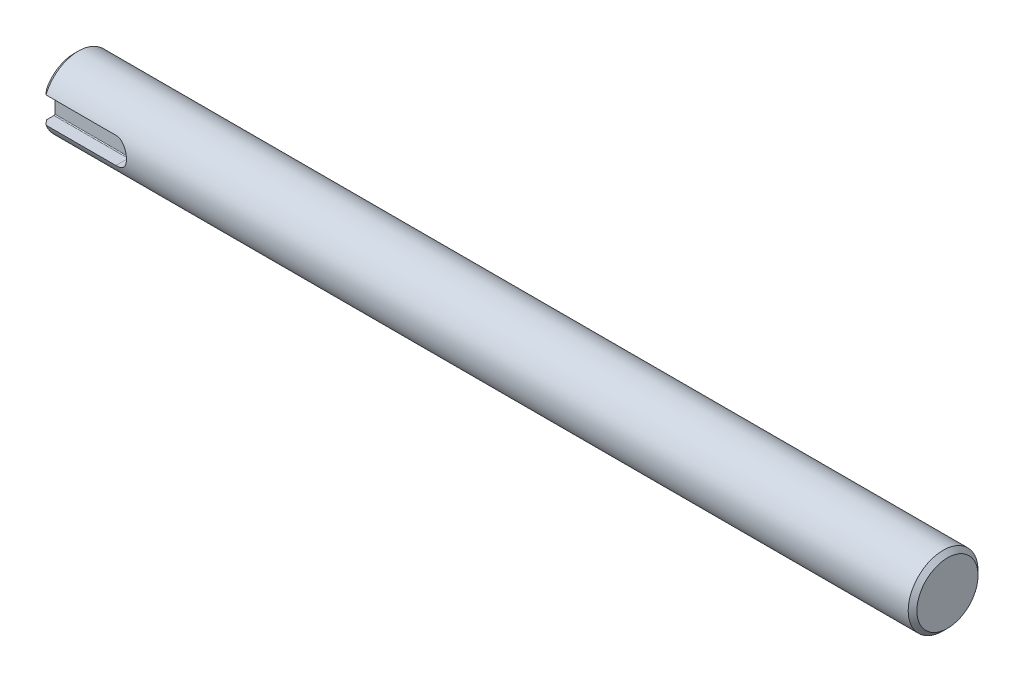
ISO-10303-21;
HEADER;
FILE_DESCRIPTION(('STEP AP214'),'2;1');
FILE_NAME('part.step','',(''),(''),'','','');
FILE_SCHEMA(('AUTOMOTIVE_DESIGN { 1 0 10303 214 1 1 1 1 }'));
ENDSEC;
DATA;
#1=APPLICATION_CONTEXT('core data for automotive mechanical design processes');
#2=APPLICATION_PROTOCOL_DEFINITION('international standard','automotive_design',2000,#1);
#3=PRODUCT_CONTEXT('',#1,'mechanical');
#4=PRODUCT('Part','Part','',(#3));
#5=PRODUCT_RELATED_PRODUCT_CATEGORY('part','',(#4));
#6=PRODUCT_DEFINITION_FORMATION('','',#4);
#7=PRODUCT_DEFINITION_CONTEXT('part definition',#1,'design');
#8=PRODUCT_DEFINITION('design','',#6,#7);
#9=PRODUCT_DEFINITION_SHAPE('','',#8);
#10=(LENGTH_UNIT() NAMED_UNIT(*) SI_UNIT(.MILLI.,.METRE.));
#11=(NAMED_UNIT(*) PLANE_ANGLE_UNIT() SI_UNIT($,.RADIAN.));
#12=(NAMED_UNIT(*) SI_UNIT($,.STERADIAN.) SOLID_ANGLE_UNIT());
#13=UNCERTAINTY_MEASURE_WITH_UNIT(LENGTH_MEASURE(1.E-05),#10,'distance_accuracy_value','');
#14=(GEOMETRIC_REPRESENTATION_CONTEXT(3) GLOBAL_UNCERTAINTY_ASSIGNED_CONTEXT((#13)) GLOBAL_UNIT_ASSIGNED_CONTEXT((#10,
#11,#12)) REPRESENTATION_CONTEXT('',''));
#15=CARTESIAN_POINT('',(0.,0.,0.));
#16=DIRECTION('',(0.,0.,1.));
#17=DIRECTION('',(1.,0.,0.));
#18=AXIS2_PLACEMENT_3D('',#15,#16,#17);
#19=CARTESIAN_POINT('',(0.,4.,0.));
#20=DIRECTION('',(1.,0.,0.));
#21=DIRECTION('',(0.,0.,-1.));
#22=AXIS2_PLACEMENT_3D('',#19,#20,#21);
#23=PLANE('',#22);
#24=CARTESIAN_POINT('',(0.,1.4,2.3));
#25=DIRECTION('',(-1.,0.,0.));
#26=DIRECTION('',(0.,0.,1.));
#27=AXIS2_PLACEMENT_3D('',#24,#25,#26);
#28=CIRCLE('',#27,0.1);
#29=CARTESIAN_POINT('',(0.,1.5,2.3));
#30=VERTEX_POINT('',#29);
#31=CARTESIAN_POINT('',(0.,1.4,2.2));
#32=VERTEX_POINT('',#31);
#33=EDGE_CURVE('E110',#30,#32,#28,.T.);
#34=ORIENTED_EDGE('',*,*,#33,.F.);
#35=DIRECTION('',(0.,0.,1.));
#36=VECTOR('',#35,1.);
#37=CARTESIAN_POINT('',(0.,1.5,2.2));
#38=LINE('',#37,#36);
#39=CARTESIAN_POINT('',(0.,1.5,3.16227766016837));
#40=VERTEX_POINT('',#39);
#41=EDGE_CURVE('E128',#30,#40,#38,.T.);
#42=ORIENTED_EDGE('',*,*,#41,.T.);
#43=CARTESIAN_POINT('',(0.,0.,0.));
#44=DIRECTION('',(1.,0.,0.));
#45=DIRECTION('',(0.,0.,-1.));
#46=AXIS2_PLACEMENT_3D('',#43,#44,#45);
#47=CIRCLE('',#46,3.49999999999999);
#48=CARTESIAN_POINT('',(0.,-1.5,3.16227766016837));
#49=VERTEX_POINT('',#48);
#50=EDGE_CURVE('E147',#40,#49,#47,.F.);
#51=ORIENTED_EDGE('',*,*,#50,.T.);
#52=DIRECTION('',(0.,0.,1.));
#53=VECTOR('',#52,1.);
#54=CARTESIAN_POINT('',(0.,-1.5,2.2));
#55=LINE('',#54,#53);
#56=CARTESIAN_POINT('',(0.,-1.5,2.3));
#57=VERTEX_POINT('',#56);
#58=EDGE_CURVE('E132',#57,#49,#55,.T.);
#59=ORIENTED_EDGE('',*,*,#58,.F.);
#60=CARTESIAN_POINT('',(0.,-1.4,2.3));
#61=DIRECTION('',(-1.,0.,0.));
#62=DIRECTION('',(0.,0.,1.));
#63=AXIS2_PLACEMENT_3D('',#60,#61,#62);
#64=CIRCLE('',#63,0.1);
#65=CARTESIAN_POINT('',(0.,-1.4,2.2));
#66=VERTEX_POINT('',#65);
#67=EDGE_CURVE('E139',#57,#66,#64,.F.);
#68=ORIENTED_EDGE('',*,*,#67,.T.);
#69=DIRECTION('',(0.,-1.,0.));
#70=VECTOR('',#69,1.);
#71=CARTESIAN_POINT('',(0.,0.,2.2));
#72=LINE('',#71,#70);
#73=EDGE_CURVE('E114',#32,#66,#72,.T.);
#74=ORIENTED_EDGE('',*,*,#73,.F.);
#75=EDGE_LOOP('',(#34,#42,#51,#59,#68,#74));
#76=FACE_BOUND('',#75,.T.);
#77=ADVANCED_FACE('F39',(#76),#23,.F.);
#78=CARTESIAN_POINT('',(100.,0.,0.));
#79=DIRECTION('',(-1.,0.,0.));
#80=DIRECTION('',(0.,0.,1.));
#81=AXIS2_PLACEMENT_3D('',#78,#79,#80);
#82=PLANE('',#81);
#83=CARTESIAN_POINT('',(100.,0.,0.));
#84=DIRECTION('',(-1.,0.,0.));
#85=DIRECTION('',(0.,0.,1.));
#86=AXIS2_PLACEMENT_3D('',#83,#84,#85);
#87=CIRCLE('',#86,3.5);
#88=CARTESIAN_POINT('',(100.,0.,3.5));
#89=VERTEX_POINT('',#88);
#90=EDGE_CURVE('E156',#89,#89,#87,.F.);
#91=ORIENTED_EDGE('',*,*,#90,.T.);
#92=EDGE_LOOP('',(#91));
#93=FACE_BOUND('',#92,.T.);
#94=ADVANCED_FACE('F194',(#93),#82,.F.);
#95=CARTESIAN_POINT('',(0.,0.,0.));
#96=DIRECTION('',(-1.,0.,0.));
#97=DIRECTION('',(0.,0.,1.));
#98=AXIS2_PLACEMENT_3D('',#95,#96,#97);
#99=CYLINDRICAL_SURFACE('',#98,4.);
#100=DIRECTION('',(-1.,0.,0.));
#101=VECTOR('',#100,1.);
#102=CARTESIAN_POINT('',(0.,1.5,3.70809924354784));
#103=LINE('',#102,#101);
#104=CARTESIAN_POINT('',(0.500000000000014,1.5,3.70809924354784));
#105=VERTEX_POINT('',#104);
#106=CARTESIAN_POINT('',(8.5,1.5,3.70809924354784));
#107=VERTEX_POINT('',#106);
#108=EDGE_CURVE('E59',#105,#107,#103,.F.);
#109=ORIENTED_EDGE('',*,*,#108,.T.);
#110=CARTESIAN_POINT('',(8.5,1.5,3.70809924354784));
#111=CARTESIAN_POINT('',(8.54059253302957,1.50000149729856,3.70809443619348));
#112=CARTESIAN_POINT('',(8.58116392928776,1.49835118206537,3.70876663375751));
#113=CARTESIAN_POINT('',(8.66198453872734,1.49177905295192,3.71141673218275));
#114=CARTESIAN_POINT('',(8.70223385549319,1.48685833749724,3.71339419464461));
#115=CARTESIAN_POINT('',(8.82176721572524,1.46729482367934,3.72118975606221));
#116=CARTESIAN_POINT('',(8.90019966022716,1.44784998767984,3.7288718840421));
#117=CARTESIAN_POINT('',(9.05236751851512,1.39690233043372,3.74825217997878));
#118=CARTESIAN_POINT('',(9.12610682904074,1.36540966903062,3.75994696323811));
#119=CARTESIAN_POINT('',(9.26733352006133,1.29134097725473,3.78602388200091));
#120=CARTESIAN_POINT('',(9.33481572201242,1.24875587557702,3.80040821426565));
#121=CARTESIAN_POINT('',(9.46489191994071,1.15146603872016,3.83103589828727));
#122=CARTESIAN_POINT('',(9.52713001431817,1.09630269892843,3.84733374054253));
#123=CARTESIAN_POINT('',(9.64172359301743,0.976394584974255,3.87949782068441));
#124=CARTESIAN_POINT('',(9.6940771643404,0.9116479604297,3.8953639745168));
#125=CARTESIAN_POINT('',(9.78914021425363,0.771693719740035,3.92552893891845));
#126=CARTESIAN_POINT('',(9.8314606006837,0.696204968758627,3.93975598379754));
#127=CARTESIAN_POINT('',(9.90265191108288,0.538553622304923,3.96438035322528));
#128=CARTESIAN_POINT('',(9.93152784948689,0.456393528521805,3.97477910532576));
#129=CARTESIAN_POINT('',(9.97375771882158,0.291490050670587,3.99018690464436));
#130=CARTESIAN_POINT('',(9.98772738430395,0.208924649211909,3.99540906103973));
#131=CARTESIAN_POINT('',(10.001721197932,0.0424658385808867,4.00064014015322));
#132=CARTESIAN_POINT('',(10.0017496368019,-0.0414271540462116,4.00065066686691));
#133=CARTESIAN_POINT('',(9.98821819377104,-0.203744100069409,3.99559264174046));
#134=CARTESIAN_POINT('',(9.97533052479258,-0.282233282883084,3.99077535168084));
#135=CARTESIAN_POINT('',(9.93746372888783,-0.435840275995116,3.97693262269583));
#136=CARTESIAN_POINT('',(9.91248391535368,-0.51095789458693,3.96790694481372));
#137=CARTESIAN_POINT('',(9.85082960740423,-0.656988917196577,3.9463777060105));
#138=CARTESIAN_POINT('',(9.81399015907659,-0.727825198012179,3.93382542785069));
#139=CARTESIAN_POINT('',(9.72980796242687,-0.862486444375064,3.90651314175191));
#140=CARTESIAN_POINT('',(9.68246179821267,-0.926309119580088,3.89175241632298));
#141=CARTESIAN_POINT('',(9.57537686850888,-1.04908600084313,3.86052643048223));
#142=CARTESIAN_POINT('',(9.51507561566499,-1.10753779261244,3.84401196825708));
#143=CARTESIAN_POINT('',(9.38541586562222,-1.21369725159035,3.81182684214319));
#144=CARTESIAN_POINT('',(9.31605382535257,-1.26140069584828,3.79615651174147));
#145=CARTESIAN_POINT('',(9.16824197158619,-1.34567998313248,3.76711867941031));
#146=CARTESIAN_POINT('',(9.08962159433238,-1.38197861969245,3.75381153298453));
#147=CARTESIAN_POINT('',(8.92679367815811,-1.44059114536973,3.73171449181345));
#148=CARTESIAN_POINT('',(8.84259579506705,-1.46292853893353,3.72291700934124));
#149=CARTESIAN_POINT('',(8.71461898235224,-1.48519272209728,3.71406226852571));
#150=CARTESIAN_POINT('',(8.67189767047943,-1.49074028414002,3.71183476402567));
#151=CARTESIAN_POINT('',(8.58612593112827,-1.49814308997677,3.70885093143242));
#152=CARTESIAN_POINT('',(8.54307584697058,-1.50000176547338,3.70809323601798));
#153=CARTESIAN_POINT('',(8.5,-1.5,3.70809924354784));
#154=B_SPLINE_CURVE_WITH_KNOTS('',3,(#110,#111,#112,#113,#114,#115,#116,#117,#118,#119,#120,
#121,#122,#123,#124,#125,#126,#127,#128,#129,#130,#131,#132,#133,#134,#135,#136,#137,#138,#139,
#140,#141,#142,#143,#144,#145,#146,#147,#148,#149,#150,#151,#152,#153),.UNSPECIFIED.,.F.,.F.,(4,
2,2,2,2,2,2,2,2,2,2,2,2,2,2,2,2,2,2,2,2,4),(0.,0.121697465666187,0.24335407758642,
0.485593064591345,0.727628221922014,0.969861938431283,1.22298027419406,1.47614754705134,
1.73793539440997,1.99962552323239,2.25002925199202,2.5003559133568,2.73829765644058,
2.97625291175452,3.21767225141682,3.45917019544673,3.7147799395163,3.97048993642582,
4.23200510445915,4.49307880432491,4.62233004062784,4.75146098044213),.UNSPECIFIED.);
#155=CARTESIAN_POINT('',(8.5,-1.5,3.70809924354784));
#156=VERTEX_POINT('',#155);
#157=EDGE_CURVE('E11',#107,#156,#154,.T.);
#158=ORIENTED_EDGE('',*,*,#157,.T.);
#159=DIRECTION('',(-1.,0.,0.));
#160=VECTOR('',#159,1.);
#161=CARTESIAN_POINT('',(0.,-1.5,3.70809924354784));
#162=LINE('',#161,#160);
#163=CARTESIAN_POINT('',(0.500000000000014,-1.5,3.70809924354784));
#164=VERTEX_POINT('',#163);
#165=EDGE_CURVE('E145',#156,#164,#162,.T.);
#166=ORIENTED_EDGE('',*,*,#165,.T.);
#167=CARTESIAN_POINT('',(0.500000000000014,0.,0.));
#168=DIRECTION('',(1.,0.,0.));
#169=DIRECTION('',(0.,0.,-1.));
#170=AXIS2_PLACEMENT_3D('',#167,#168,#169);
#171=CIRCLE('',#170,4.);
#172=EDGE_CURVE('E153',#164,#105,#171,.T.);
#173=ORIENTED_EDGE('',*,*,#172,.T.);
#174=EDGE_LOOP('',(#109,#158,#166,#173));
#175=FACE_BOUND('',#174,.T.);
#176=CARTESIAN_POINT('',(99.5,0.,0.));
#177=DIRECTION('',(-1.,0.,0.));
#178=DIRECTION('',(0.,0.,1.));
#179=AXIS2_PLACEMENT_3D('',#176,#177,#178);
#180=CIRCLE('',#179,4.);
#181=CARTESIAN_POINT('',(99.5,0.,4.));
#182=VERTEX_POINT('',#181);
#183=EDGE_CURVE('E150',#182,#182,#180,.T.);
#184=ORIENTED_EDGE('',*,*,#183,.T.);
#185=EDGE_LOOP('',(#184));
#186=FACE_BOUND('',#185,.T.);
#187=ADVANCED_FACE('F190',(#175,#186),#99,.T.);
#188=CARTESIAN_POINT('',(0.,0.,0.));
#189=DIRECTION('',(1.,0.,0.));
#190=DIRECTION('',(0.,0.,-1.));
#191=AXIS2_PLACEMENT_3D('',#188,#189,#190);
#192=CONICAL_SURFACE('',#191,3.49999999999999,0.785398163397448);
#193=CARTESIAN_POINT('',(-1.85676679937408,-1.5,0.670980887685524));
#194=CARTESIAN_POINT('',(-1.84292326170089,-1.5,0.704876485598539));
#195=CARTESIAN_POINT('',(-1.82833974820999,-1.5,0.738459422873453));
#196=CARTESIAN_POINT('',(-1.79788832773196,-1.5,0.805022677622019));
#197=CARTESIAN_POINT('',(-1.78202094525331,-1.5,0.83800323450806));
#198=CARTESIAN_POINT('',(-1.73282539376804,-1.5,0.936002344038984));
#199=CARTESIAN_POINT('',(-1.69785428783483,-1.5,1.00019611133327));
#200=CARTESIAN_POINT('',(-1.62484888420208,-1.5,1.12642374575588));
#201=CARTESIAN_POINT('',(-1.58682826891298,-1.5,1.18846564841073));
#202=CARTESIAN_POINT('',(-1.50836711540055,-1.5,1.31103411954503));
#203=CARTESIAN_POINT('',(-1.46792537574064,-1.5,1.37155991419774));
#204=CARTESIAN_POINT('',(-1.34442501979026,-1.5,1.55047641081804));
#205=CARTESIAN_POINT('',(-1.25869962286764,-1.5,1.66701909971281));
#206=CARTESIAN_POINT('',(-1.08282370759301,-1.5,1.8968839225221));
#207=CARTESIAN_POINT('',(-0.992667871671905,-1.5,2.01020191520472));
#208=CARTESIAN_POINT('',(-0.811969632541268,-1.5,2.23147168625901));
#209=CARTESIAN_POINT('',(-0.721503237723414,-1.5,2.33948576537084));
#210=CARTESIAN_POINT('',(-0.538737138479867,-1.5,2.55386079562799));
#211=CARTESIAN_POINT('',(-0.446438268920255,-1.5,2.66022246194395));
#212=CARTESIAN_POINT('',(-0.26021619188821,-1.5,2.872064414637));
#213=CARTESIAN_POINT('',(-0.166289019107158,-1.5,2.97754120772266));
#214=CARTESIAN_POINT('',(0.0225924116713601,-1.5,3.1875943308391));
#215=CARTESIAN_POINT('',(0.117546802759282,-1.5,3.29217054095639));
#216=CARTESIAN_POINT('',(0.405226386826548,-1.5,3.60667122035174));
#217=CARTESIAN_POINT('',(0.59912695187768,-1.5,3.81551965239438));
#218=CARTESIAN_POINT('',(0.988835850320497,-1.5,4.23141175695917));
#219=CARTESIAN_POINT('',(1.18464413798095,-1.5,4.43845547251902));
#220=CARTESIAN_POINT('',(1.57626112718909,-1.5,4.84999280380419));
#221=CARTESIAN_POINT('',(1.77206160832118,-1.5,5.0544942505549));
#222=CARTESIAN_POINT('',(2.16456294208572,-1.5,5.46262306355937));
#223=CARTESIAN_POINT('',(2.3612637747329,-1.5,5.66625044902225));
#224=CARTESIAN_POINT('',(2.55824100595889,-1.5,5.8696068084908));
#225=B_SPLINE_CURVE_WITH_KNOTS('',3,(#193,#194,#195,#196,#197,#198,#199,#200,#201,#202,#203,
#204,#205,#206,#207,#208,#209,#210,#211,#212,#213,#214,#215,#216,#217,#218,#219,#220,#221,#222,
#223,#224),.UNSPECIFIED.,.F.,.F.,(4,2,2,2,2,2,2,2,2,2,2,2,2,2,2,4),(0.,0.10981715559394,
0.219589671132237,0.438752293991246,0.656981377198208,0.875319664759884,1.30915190182222,
1.74351820176478,2.1661692256757,2.58863192062533,3.01233179777454,3.43608724477198,
4.29101183619155,5.14591598385076,5.99528181289137,6.84462887895922),.UNSPECIFIED.);
#226=EDGE_CURVE('E52',#49,#164,#225,.T.);
#227=ORIENTED_EDGE('',*,*,#226,.F.);
#228=ORIENTED_EDGE('',*,*,#50,.F.);
#229=CARTESIAN_POINT('',(2.55824100595889,1.5,5.8696068084908));
#230=CARTESIAN_POINT('',(2.36024981970104,1.5,5.6652026941598));
#231=CARTESIAN_POINT('',(2.16253721528119,1.5,5.46052535281222));
#232=CARTESIAN_POINT('',(1.76815967780175,1.5,5.05042771355929));
#233=CARTESIAN_POINT('',(1.57149413249687,1.5,4.84500800409183));
#234=CARTESIAN_POINT('',(1.18003294904086,1.5,4.43358459644393));
#235=CARTESIAN_POINT('',(0.985233438423021,1.5,4.22758458687081));
#236=CARTESIAN_POINT('',(0.597401604380693,1.5,3.81366061393438));
#237=CARTESIAN_POINT('',(0.404370553640828,1.5,3.60573545300133));
#238=CARTESIAN_POINT('',(0.116589947823809,1.5,3.29112454776119));
#239=CARTESIAN_POINT('',(0.0206864638308226,1.5,3.18549523117106));
#240=CARTESIAN_POINT('',(-0.170071150627406,1.5,2.97331392066693));
#241=CARTESIAN_POINT('',(-0.264925403507678,1.5,2.86676203703198));
#242=CARTESIAN_POINT('',(-0.453076264954302,1.5,2.65261320272489));
#243=CARTESIAN_POINT('',(-0.546375269245328,1.5,2.54501836157467));
#244=CARTESIAN_POINT('',(-0.731079231103235,1.5,2.32812508226573));
#245=CARTESIAN_POINT('',(-0.822483336335923,1.5,2.21882591462934));
#246=CARTESIAN_POINT('',(-1.00300069372992,1.5,1.99728790504986));
#247=CARTESIAN_POINT('',(-1.09209761133524,1.5,1.88503570341239));
#248=CARTESIAN_POINT('',(-1.26588262303073,1.5,1.65732895631385));
#249=CARTESIAN_POINT('',(-1.35057597553131,1.5,1.54187849495607));
#250=CARTESIAN_POINT('',(-1.47257547808348,1.5,1.36465221528138));
#251=CARTESIAN_POINT('',(-1.51252247725899,1.5,1.30470174763445));
#252=CARTESIAN_POINT('',(-1.59001969788514,1.5,1.18330498544497));
#253=CARTESIAN_POINT('',(-1.62757108650284,1.5,1.12185943979293));
#254=CARTESIAN_POINT('',(-1.69969332497195,1.5,0.996863497643223));
#255=CARTESIAN_POINT('',(-1.73425086582248,1.5,0.933305282934134));
#256=CARTESIAN_POINT('',(-1.7990628469444,1.5,0.803909045067892));
#257=CARTESIAN_POINT('',(-1.82930974881065,1.5,0.73806727243753));
#258=CARTESIAN_POINT('',(-1.85676679937408,1.5,0.670980887685526));
#259=B_SPLINE_CURVE_WITH_KNOTS('',3,(#229,#230,#231,#232,#233,#234,#235,#236,#237,#238,#239,
#240,#241,#242,#243,#244,#245,#246,#247,#248,#249,#250,#251,#252,#253,#254,#255,#256,#257,#258),
.UNSPECIFIED.,.F.,.F.,(4,2,2,2,2,2,2,2,2,2,2,2,2,2,4),(0.,0.853721298343058,1.70687162980706,
2.55742146698875,3.40854168570163,3.83654998657544,4.26450781303734,4.69173052735177,
5.11914141226976,5.54902780710377,5.9783884832827,6.19446699589126,6.41043941581507,
6.62732732525518,6.84458999047528),.UNSPECIFIED.);
#260=EDGE_CURVE('E159',#105,#40,#259,.T.);
#261=ORIENTED_EDGE('',*,*,#260,.F.);
#262=ORIENTED_EDGE('',*,*,#172,.F.);
#263=EDGE_LOOP('',(#227,#228,#261,#262));
#264=FACE_BOUND('',#263,.T.);
#265=ADVANCED_FACE('F168',(#264),#192,.T.);
#266=CARTESIAN_POINT('',(99.5,0.,0.));
#267=DIRECTION('',(-1.,0.,0.));
#268=DIRECTION('',(0.,0.,1.));
#269=AXIS2_PLACEMENT_3D('',#266,#267,#268);
#270=CONICAL_SURFACE('',#269,4.,0.785398163397448);
#271=ORIENTED_EDGE('',*,*,#90,.F.);
#272=EDGE_LOOP('',(#271));
#273=FACE_BOUND('',#272,.T.);
#274=ORIENTED_EDGE('',*,*,#183,.F.);
#275=EDGE_LOOP('',(#274));
#276=FACE_BOUND('',#275,.T.);
#277=ADVANCED_FACE('F41',(#273,#276),#270,.T.);
#278=CARTESIAN_POINT('',(8.5,0.,4.));
#279=DIRECTION('',(0.,0.,1.));
#280=DIRECTION('',(1.,0.,0.));
#281=AXIS2_PLACEMENT_3D('',#278,#279,#280);
#282=CYLINDRICAL_SURFACE('',#281,1.5);
#283=DIRECTION('',(0.,0.,1.));
#284=VECTOR('',#283,1.);
#285=CARTESIAN_POINT('',(8.5,1.5,2.2));
#286=LINE('',#285,#284);
#287=CARTESIAN_POINT('',(8.5,1.5,2.3));
#288=VERTEX_POINT('',#287);
#289=EDGE_CURVE('E215',#107,#288,#286,.F.);
#290=ORIENTED_EDGE('',*,*,#289,.T.);
#291=CARTESIAN_POINT('',(8.5,0.,2.3));
#292=DIRECTION('',(0.,0.,1.));
#293=DIRECTION('',(1.,0.,0.));
#294=AXIS2_PLACEMENT_3D('',#291,#292,#293);
#295=CIRCLE('',#294,1.5);
#296=CARTESIAN_POINT('',(8.5,-1.5,2.3));
#297=VERTEX_POINT('',#296);
#298=EDGE_CURVE('E127',#297,#288,#295,.T.);
#299=ORIENTED_EDGE('',*,*,#298,.F.);
#300=DIRECTION('',(0.,0.,1.));
#301=VECTOR('',#300,1.);
#302=CARTESIAN_POINT('',(8.5,-1.5,2.2));
#303=LINE('',#302,#301);
#304=EDGE_CURVE('E138',#297,#156,#303,.T.);
#305=ORIENTED_EDGE('',*,*,#304,.T.);
#306=ORIENTED_EDGE('',*,*,#157,.F.);
#307=EDGE_LOOP('',(#290,#299,#305,#306));
#308=FACE_BOUND('',#307,.T.);
#309=ADVANCED_FACE('F176',(#308),#282,.F.);
#310=CARTESIAN_POINT('',(0.,-1.5,2.2));
#311=DIRECTION('',(0.,-1.,0.));
#312=DIRECTION('',(1.,0.,0.));
#313=AXIS2_PLACEMENT_3D('',#310,#311,#312);
#314=PLANE('',#313);
#315=ORIENTED_EDGE('',*,*,#304,.F.);
#316=DIRECTION('',(1.,0.,0.));
#317=VECTOR('',#316,1.);
#318=CARTESIAN_POINT('',(8.5,-1.5,2.3));
#319=LINE('',#318,#317);
#320=EDGE_CURVE('E206',#57,#297,#319,.T.);
#321=ORIENTED_EDGE('',*,*,#320,.F.);
#322=ORIENTED_EDGE('',*,*,#58,.T.);
#323=ORIENTED_EDGE('',*,*,#226,.T.);
#324=ORIENTED_EDGE('',*,*,#165,.F.);
#325=EDGE_LOOP('',(#315,#321,#322,#323,#324));
#326=FACE_BOUND('',#325,.T.);
#327=ADVANCED_FACE('F174',(#326),#314,.F.);
#328=CARTESIAN_POINT('',(0.,1.5,2.2));
#329=DIRECTION('',(0.,1.,0.));
#330=DIRECTION('',(-1.,0.,0.));
#331=AXIS2_PLACEMENT_3D('',#328,#329,#330);
#332=PLANE('',#331);
#333=ORIENTED_EDGE('',*,*,#260,.T.);
#334=ORIENTED_EDGE('',*,*,#41,.F.);
#335=DIRECTION('',(-1.,0.,0.));
#336=VECTOR('',#335,1.);
#337=CARTESIAN_POINT('',(0.,1.5,2.3));
#338=LINE('',#337,#336);
#339=EDGE_CURVE('E142',#288,#30,#338,.T.);
#340=ORIENTED_EDGE('',*,*,#339,.F.);
#341=ORIENTED_EDGE('',*,*,#289,.F.);
#342=ORIENTED_EDGE('',*,*,#108,.F.);
#343=EDGE_LOOP('',(#333,#334,#340,#341,#342));
#344=FACE_BOUND('',#343,.T.);
#345=ADVANCED_FACE('F171',(#344),#332,.F.);
#346=CARTESIAN_POINT('',(0.,0.,2.2));
#347=DIRECTION('',(0.,0.,1.));
#348=DIRECTION('',(1.,0.,0.));
#349=AXIS2_PLACEMENT_3D('',#346,#347,#348);
#350=PLANE('',#349);
#351=DIRECTION('',(1.,0.,0.));
#352=VECTOR('',#351,1.);
#353=CARTESIAN_POINT('',(0.,-1.4,2.2));
#354=LINE('',#353,#352);
#355=CARTESIAN_POINT('',(8.5,-1.4,2.2));
#356=VERTEX_POINT('',#355);
#357=EDGE_CURVE('E119',#356,#66,#354,.F.);
#358=ORIENTED_EDGE('',*,*,#357,.F.);
#359=CARTESIAN_POINT('',(8.5,0.,2.2));
#360=DIRECTION('',(0.,0.,1.));
#361=DIRECTION('',(1.,0.,0.));
#362=AXIS2_PLACEMENT_3D('',#359,#360,#361);
#363=CIRCLE('',#362,1.4);
#364=CARTESIAN_POINT('',(8.5,1.4,2.2));
#365=VERTEX_POINT('',#364);
#366=EDGE_CURVE('E113',#365,#356,#363,.F.);
#367=ORIENTED_EDGE('',*,*,#366,.F.);
#368=DIRECTION('',(-1.,0.,0.));
#369=VECTOR('',#368,1.);
#370=CARTESIAN_POINT('',(8.5,1.4,2.2));
#371=LINE('',#370,#369);
#372=EDGE_CURVE('E103',#32,#365,#371,.F.);
#373=ORIENTED_EDGE('',*,*,#372,.F.);
#374=ORIENTED_EDGE('',*,*,#73,.T.);
#375=EDGE_LOOP('',(#358,#367,#373,#374));
#376=FACE_BOUND('',#375,.T.);
#377=ADVANCED_FACE('F117',(#376),#350,.T.);
#378=CARTESIAN_POINT('',(8.5,0.,2.3));
#379=DIRECTION('',(0.,0.,1.));
#380=DIRECTION('',(1.,0.,0.));
#381=AXIS2_PLACEMENT_3D('',#378,#379,#380);
#382=TOROIDAL_SURFACE('',#381,1.4,0.1);
#383=CARTESIAN_POINT('',(8.5,-1.4,2.3));
#384=DIRECTION('',(-1.,0.,0.));
#385=DIRECTION('',(0.,0.,1.));
#386=AXIS2_PLACEMENT_3D('',#383,#384,#385);
#387=CIRCLE('',#386,0.1);
#388=EDGE_CURVE('E129',#356,#297,#387,.T.);
#389=ORIENTED_EDGE('',*,*,#388,.T.);
#390=ORIENTED_EDGE('',*,*,#298,.T.);
#391=CARTESIAN_POINT('',(8.5,1.4,2.3));
#392=DIRECTION('',(-1.,0.,0.));
#393=DIRECTION('',(0.,0.,1.));
#394=AXIS2_PLACEMENT_3D('',#391,#392,#393);
#395=CIRCLE('',#394,0.1);
#396=EDGE_CURVE('E107',#288,#365,#395,.T.);
#397=ORIENTED_EDGE('',*,*,#396,.T.);
#398=ORIENTED_EDGE('',*,*,#366,.T.);
#399=EDGE_LOOP('',(#389,#390,#397,#398));
#400=FACE_BOUND('',#399,.T.);
#401=ADVANCED_FACE('F125',(#400),#382,.F.);
#402=CARTESIAN_POINT('',(0.,1.4,2.3));
#403=DIRECTION('',(1.,0.,0.));
#404=DIRECTION('',(0.,1.,0.));
#405=AXIS2_PLACEMENT_3D('',#402,#403,#404);
#406=CYLINDRICAL_SURFACE('',#405,0.1);
#407=ORIENTED_EDGE('',*,*,#396,.F.);
#408=ORIENTED_EDGE('',*,*,#339,.T.);
#409=ORIENTED_EDGE('',*,*,#33,.T.);
#410=ORIENTED_EDGE('',*,*,#372,.T.);
#411=EDGE_LOOP('',(#407,#408,#409,#410));
#412=FACE_BOUND('',#411,.T.);
#413=ADVANCED_FACE('F105',(#412),#406,.F.);
#414=CARTESIAN_POINT('',(0.,-1.4,2.3));
#415=DIRECTION('',(-1.,0.,0.));
#416=DIRECTION('',(0.,-1.,0.));
#417=AXIS2_PLACEMENT_3D('',#414,#415,#416);
#418=CYLINDRICAL_SURFACE('',#417,0.1);
#419=ORIENTED_EDGE('',*,*,#388,.F.);
#420=ORIENTED_EDGE('',*,*,#357,.T.);
#421=ORIENTED_EDGE('',*,*,#67,.F.);
#422=ORIENTED_EDGE('',*,*,#320,.T.);
#423=EDGE_LOOP('',(#419,#420,#421,#422));
#424=FACE_BOUND('',#423,.T.);
#425=ADVANCED_FACE('F181',(#424),#418,.F.);
#426=CLOSED_SHELL('',(#77,#94,#187,#265,#277,#309,#327,#345,#377,#401,#413,#425));
#427=MANIFOLD_SOLID_BREP('B2',#426);
#428=ADVANCED_BREP_SHAPE_REPRESENTATION('',(#18,#427),#14);
#429=SHAPE_DEFINITION_REPRESENTATION(#9,#428);
ENDSEC;
END-ISO-10303-21;
